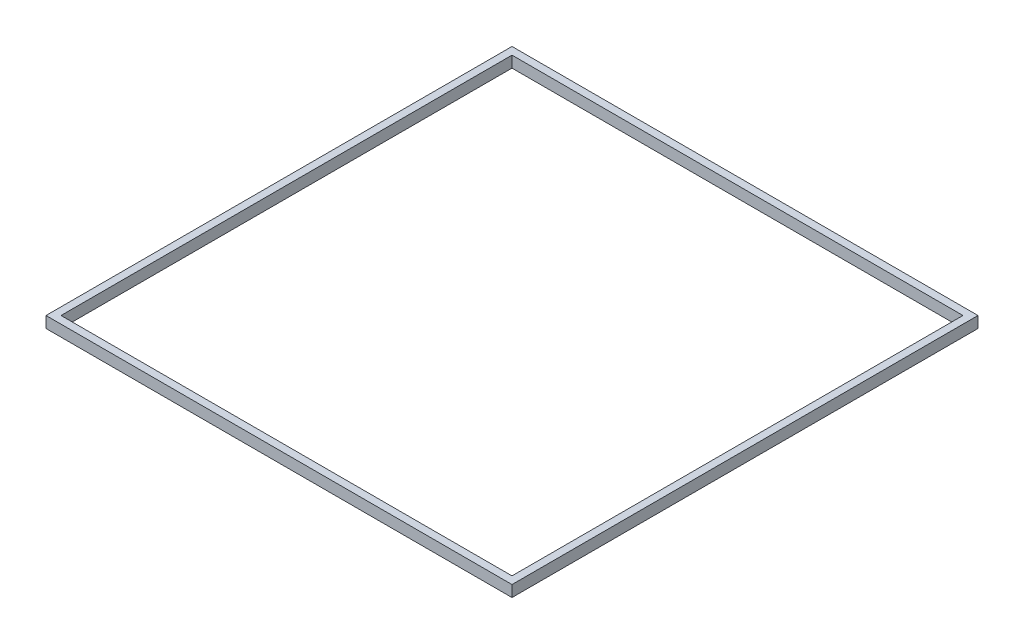
ISO-10303-21;
HEADER;
FILE_DESCRIPTION(('STEP AP214'),'2;1');
FILE_NAME('part.step','',(''),(''),'','','');
FILE_SCHEMA(('AUTOMOTIVE_DESIGN { 1 0 10303 214 1 1 1 1 }'));
ENDSEC;
DATA;
#1=APPLICATION_CONTEXT('core data for automotive mechanical design processes');
#2=APPLICATION_PROTOCOL_DEFINITION('international standard','automotive_design',2000,#1);
#3=PRODUCT_CONTEXT('',#1,'mechanical');
#4=PRODUCT('Part','Part','',(#3));
#5=PRODUCT_RELATED_PRODUCT_CATEGORY('part','',(#4));
#6=PRODUCT_DEFINITION_FORMATION('','',#4);
#7=PRODUCT_DEFINITION_CONTEXT('part definition',#1,'design');
#8=PRODUCT_DEFINITION('design','',#6,#7);
#9=PRODUCT_DEFINITION_SHAPE('','',#8);
#10=(LENGTH_UNIT() NAMED_UNIT(*) SI_UNIT(.MILLI.,.METRE.));
#11=(NAMED_UNIT(*) PLANE_ANGLE_UNIT() SI_UNIT($,.RADIAN.));
#12=(NAMED_UNIT(*) SI_UNIT($,.STERADIAN.) SOLID_ANGLE_UNIT());
#13=UNCERTAINTY_MEASURE_WITH_UNIT(LENGTH_MEASURE(1.E-05),#10,'distance_accuracy_value','');
#14=(GEOMETRIC_REPRESENTATION_CONTEXT(3) GLOBAL_UNCERTAINTY_ASSIGNED_CONTEXT((#13)) GLOBAL_UNIT_ASSIGNED_CONTEXT((#10,
#11,#12)) REPRESENTATION_CONTEXT('',''));
#15=CARTESIAN_POINT('',(0.,0.,0.));
#16=DIRECTION('',(0.,0.,1.));
#17=DIRECTION('',(1.,0.,0.));
#18=AXIS2_PLACEMENT_3D('',#15,#16,#17);
#19=CARTESIAN_POINT('',(0.,15.,0.));
#20=DIRECTION('',(0.,-1.,0.));
#21=DIRECTION('',(0.,0.,-1.));
#22=AXIS2_PLACEMENT_3D('',#19,#20,#21);
#23=PLANE('',#22);
#24=DIRECTION('',(0.,0.,-1.));
#25=VECTOR('',#24,1.);
#26=CARTESIAN_POINT('',(620.,15.,620.));
#27=LINE('',#26,#25);
#28=CARTESIAN_POINT('',(620.,15.,620.));
#29=VERTEX_POINT('',#28);
#30=CARTESIAN_POINT('',(620.,15.,-620.));
#31=VERTEX_POINT('',#30);
#32=EDGE_CURVE('E133',#29,#31,#27,.T.);
#33=ORIENTED_EDGE('',*,*,#32,.T.);
#34=DIRECTION('',(-1.,0.,0.));
#35=VECTOR('',#34,1.);
#36=CARTESIAN_POINT('',(-620.,15.,-620.));
#37=LINE('',#36,#35);
#38=CARTESIAN_POINT('',(-620.,15.,-620.));
#39=VERTEX_POINT('',#38);
#40=EDGE_CURVE('E136',#31,#39,#37,.T.);
#41=ORIENTED_EDGE('',*,*,#40,.T.);
#42=DIRECTION('',(0.,0.,1.));
#43=VECTOR('',#42,1.);
#44=CARTESIAN_POINT('',(-620.,15.,620.));
#45=LINE('',#44,#43);
#46=CARTESIAN_POINT('',(-620.,15.,620.));
#47=VERTEX_POINT('',#46);
#48=EDGE_CURVE('E139',#39,#47,#45,.T.);
#49=ORIENTED_EDGE('',*,*,#48,.T.);
#50=DIRECTION('',(1.,0.,0.));
#51=VECTOR('',#50,1.);
#52=CARTESIAN_POINT('',(-620.,15.,620.));
#53=LINE('',#52,#51);
#54=EDGE_CURVE('E141',#47,#29,#53,.T.);
#55=ORIENTED_EDGE('',*,*,#54,.T.);
#56=EDGE_LOOP('',(#33,#41,#49,#55));
#57=FACE_BOUND('',#56,.T.);
#58=DIRECTION('',(0.,0.,-1.));
#59=VECTOR('',#58,1.);
#60=CARTESIAN_POINT('',(600.,15.,600.));
#61=LINE('',#60,#59);
#62=CARTESIAN_POINT('',(600.,15.,600.));
#63=VERTEX_POINT('',#62);
#64=CARTESIAN_POINT('',(600.,15.,-600.));
#65=VERTEX_POINT('',#64);
#66=EDGE_CURVE('E97',#63,#65,#61,.T.);
#67=ORIENTED_EDGE('',*,*,#66,.F.);
#68=DIRECTION('',(1.,0.,0.));
#69=VECTOR('',#68,1.);
#70=CARTESIAN_POINT('',(-600.,15.,600.));
#71=LINE('',#70,#69);
#72=CARTESIAN_POINT('',(-600.,15.,600.));
#73=VERTEX_POINT('',#72);
#74=EDGE_CURVE('E119',#73,#63,#71,.T.);
#75=ORIENTED_EDGE('',*,*,#74,.F.);
#76=DIRECTION('',(0.,0.,1.));
#77=VECTOR('',#76,1.);
#78=CARTESIAN_POINT('',(-600.,15.,600.));
#79=LINE('',#78,#77);
#80=CARTESIAN_POINT('',(-600.,15.,-600.));
#81=VERTEX_POINT('',#80);
#82=EDGE_CURVE('E117',#81,#73,#79,.T.);
#83=ORIENTED_EDGE('',*,*,#82,.F.);
#84=DIRECTION('',(-1.,0.,0.));
#85=VECTOR('',#84,1.);
#86=CARTESIAN_POINT('',(-600.,15.,-600.));
#87=LINE('',#86,#85);
#88=EDGE_CURVE('E105',#65,#81,#87,.T.);
#89=ORIENTED_EDGE('',*,*,#88,.F.);
#90=EDGE_LOOP('',(#67,#75,#83,#89));
#91=FACE_BOUND('',#90,.T.);
#92=ADVANCED_FACE('F32',(#57,#91),#23,.F.);
#93=CARTESIAN_POINT('',(0.,-15.,0.));
#94=DIRECTION('',(0.,-1.,0.));
#95=DIRECTION('',(0.,0.,-1.));
#96=AXIS2_PLACEMENT_3D('',#93,#94,#95);
#97=PLANE('',#96);
#98=DIRECTION('',(0.,0.,-1.));
#99=VECTOR('',#98,1.);
#100=CARTESIAN_POINT('',(620.,-15.,620.));
#101=LINE('',#100,#99);
#102=CARTESIAN_POINT('',(620.,-15.,620.));
#103=VERTEX_POINT('',#102);
#104=CARTESIAN_POINT('',(620.,-15.,-620.));
#105=VERTEX_POINT('',#104);
#106=EDGE_CURVE('E113',#103,#105,#101,.T.);
#107=ORIENTED_EDGE('',*,*,#106,.F.);
#108=DIRECTION('',(1.,0.,0.));
#109=VECTOR('',#108,1.);
#110=CARTESIAN_POINT('',(-620.,-15.,620.));
#111=LINE('',#110,#109);
#112=CARTESIAN_POINT('',(-620.,-15.,620.));
#113=VERTEX_POINT('',#112);
#114=EDGE_CURVE('E137',#113,#103,#111,.T.);
#115=ORIENTED_EDGE('',*,*,#114,.F.);
#116=DIRECTION('',(0.,0.,1.));
#117=VECTOR('',#116,1.);
#118=CARTESIAN_POINT('',(-620.,-15.,620.));
#119=LINE('',#118,#117);
#120=CARTESIAN_POINT('',(-620.,-15.,-620.));
#121=VERTEX_POINT('',#120);
#122=EDGE_CURVE('E148',#121,#113,#119,.T.);
#123=ORIENTED_EDGE('',*,*,#122,.F.);
#124=DIRECTION('',(-1.,0.,0.));
#125=VECTOR('',#124,1.);
#126=CARTESIAN_POINT('',(-620.,-15.,-620.));
#127=LINE('',#126,#125);
#128=EDGE_CURVE('E146',#105,#121,#127,.T.);
#129=ORIENTED_EDGE('',*,*,#128,.F.);
#130=EDGE_LOOP('',(#107,#115,#123,#129));
#131=FACE_BOUND('',#130,.T.);
#132=DIRECTION('',(1.,0.,0.));
#133=VECTOR('',#132,1.);
#134=CARTESIAN_POINT('',(-600.,-15.,600.));
#135=LINE('',#134,#133);
#136=CARTESIAN_POINT('',(-600.,-15.,600.));
#137=VERTEX_POINT('',#136);
#138=CARTESIAN_POINT('',(600.,-15.,600.));
#139=VERTEX_POINT('',#138);
#140=EDGE_CURVE('E106',#137,#139,#135,.T.);
#141=ORIENTED_EDGE('',*,*,#140,.T.);
#142=DIRECTION('',(0.,0.,-1.));
#143=VECTOR('',#142,1.);
#144=CARTESIAN_POINT('',(600.,-15.,600.));
#145=LINE('',#144,#143);
#146=CARTESIAN_POINT('',(600.,-15.,-600.));
#147=VERTEX_POINT('',#146);
#148=EDGE_CURVE('E55',#139,#147,#145,.T.);
#149=ORIENTED_EDGE('',*,*,#148,.T.);
#150=DIRECTION('',(-1.,0.,0.));
#151=VECTOR('',#150,1.);
#152=CARTESIAN_POINT('',(-600.,-15.,-600.));
#153=LINE('',#152,#151);
#154=CARTESIAN_POINT('',(-600.,-15.,-600.));
#155=VERTEX_POINT('',#154);
#156=EDGE_CURVE('E112',#147,#155,#153,.T.);
#157=ORIENTED_EDGE('',*,*,#156,.T.);
#158=DIRECTION('',(0.,0.,1.));
#159=VECTOR('',#158,1.);
#160=CARTESIAN_POINT('',(-600.,-15.,600.));
#161=LINE('',#160,#159);
#162=EDGE_CURVE('E125',#155,#137,#161,.T.);
#163=ORIENTED_EDGE('',*,*,#162,.T.);
#164=EDGE_LOOP('',(#141,#149,#157,#163));
#165=FACE_BOUND('',#164,.T.);
#166=ADVANCED_FACE('F166',(#131,#165),#97,.T.);
#167=CARTESIAN_POINT('',(620.,15.,620.));
#168=DIRECTION('',(-1.,0.,0.));
#169=DIRECTION('',(0.,0.,1.));
#170=AXIS2_PLACEMENT_3D('',#167,#168,#169);
#171=PLANE('',#170);
#172=ORIENTED_EDGE('',*,*,#106,.T.);
#173=DIRECTION('',(0.,-1.,0.));
#174=VECTOR('',#173,1.);
#175=CARTESIAN_POINT('',(620.,15.,-620.));
#176=LINE('',#175,#174);
#177=EDGE_CURVE('E11',#31,#105,#176,.T.);
#178=ORIENTED_EDGE('',*,*,#177,.F.);
#179=ORIENTED_EDGE('',*,*,#32,.F.);
#180=DIRECTION('',(0.,-1.,0.));
#181=VECTOR('',#180,1.);
#182=CARTESIAN_POINT('',(620.,15.,620.));
#183=LINE('',#182,#181);
#184=EDGE_CURVE('E143',#29,#103,#183,.T.);
#185=ORIENTED_EDGE('',*,*,#184,.T.);
#186=EDGE_LOOP('',(#172,#178,#179,#185));
#187=FACE_BOUND('',#186,.T.);
#188=ADVANCED_FACE('F34',(#187),#171,.F.);
#189=CARTESIAN_POINT('',(-620.,15.,-620.));
#190=DIRECTION('',(0.,0.,1.));
#191=DIRECTION('',(1.,0.,0.));
#192=AXIS2_PLACEMENT_3D('',#189,#190,#191);
#193=PLANE('',#192);
#194=ORIENTED_EDGE('',*,*,#128,.T.);
#195=DIRECTION('',(0.,-1.,0.));
#196=VECTOR('',#195,1.);
#197=CARTESIAN_POINT('',(-620.,15.,-620.));
#198=LINE('',#197,#196);
#199=EDGE_CURVE('E40',#39,#121,#198,.T.);
#200=ORIENTED_EDGE('',*,*,#199,.F.);
#201=ORIENTED_EDGE('',*,*,#40,.F.);
#202=ORIENTED_EDGE('',*,*,#177,.T.);
#203=EDGE_LOOP('',(#194,#200,#201,#202));
#204=FACE_BOUND('',#203,.T.);
#205=ADVANCED_FACE('F176',(#204),#193,.F.);
#206=CARTESIAN_POINT('',(-620.,15.,620.));
#207=DIRECTION('',(1.,0.,0.));
#208=DIRECTION('',(0.,0.,-1.));
#209=AXIS2_PLACEMENT_3D('',#206,#207,#208);
#210=PLANE('',#209);
#211=ORIENTED_EDGE('',*,*,#122,.T.);
#212=DIRECTION('',(0.,-1.,0.));
#213=VECTOR('',#212,1.);
#214=CARTESIAN_POINT('',(-620.,15.,620.));
#215=LINE('',#214,#213);
#216=EDGE_CURVE('E153',#47,#113,#215,.T.);
#217=ORIENTED_EDGE('',*,*,#216,.F.);
#218=ORIENTED_EDGE('',*,*,#48,.F.);
#219=ORIENTED_EDGE('',*,*,#199,.T.);
#220=EDGE_LOOP('',(#211,#217,#218,#219));
#221=FACE_BOUND('',#220,.T.);
#222=ADVANCED_FACE('F160',(#221),#210,.F.);
#223=CARTESIAN_POINT('',(-620.,15.,620.));
#224=DIRECTION('',(0.,0.,-1.));
#225=DIRECTION('',(-1.,0.,0.));
#226=AXIS2_PLACEMENT_3D('',#223,#224,#225);
#227=PLANE('',#226);
#228=ORIENTED_EDGE('',*,*,#114,.T.);
#229=ORIENTED_EDGE('',*,*,#184,.F.);
#230=ORIENTED_EDGE('',*,*,#54,.F.);
#231=ORIENTED_EDGE('',*,*,#216,.T.);
#232=EDGE_LOOP('',(#228,#229,#230,#231));
#233=FACE_BOUND('',#232,.T.);
#234=ADVANCED_FACE('F170',(#233),#227,.F.);
#235=CARTESIAN_POINT('',(600.,15.,600.));
#236=DIRECTION('',(-1.,0.,0.));
#237=DIRECTION('',(0.,0.,1.));
#238=AXIS2_PLACEMENT_3D('',#235,#236,#237);
#239=PLANE('',#238);
#240=ORIENTED_EDGE('',*,*,#148,.F.);
#241=DIRECTION('',(0.,-1.,0.));
#242=VECTOR('',#241,1.);
#243=CARTESIAN_POINT('',(600.,15.,600.));
#244=LINE('',#243,#242);
#245=EDGE_CURVE('E101',#63,#139,#244,.T.);
#246=ORIENTED_EDGE('',*,*,#245,.F.);
#247=ORIENTED_EDGE('',*,*,#66,.T.);
#248=DIRECTION('',(0.,-1.,0.));
#249=VECTOR('',#248,1.);
#250=CARTESIAN_POINT('',(600.,15.,-600.));
#251=LINE('',#250,#249);
#252=EDGE_CURVE('E100',#65,#147,#251,.T.);
#253=ORIENTED_EDGE('',*,*,#252,.T.);
#254=EDGE_LOOP('',(#240,#246,#247,#253));
#255=FACE_BOUND('',#254,.T.);
#256=ADVANCED_FACE('F99',(#255),#239,.T.);
#257=CARTESIAN_POINT('',(-600.,15.,-600.));
#258=DIRECTION('',(0.,0.,1.));
#259=DIRECTION('',(1.,0.,0.));
#260=AXIS2_PLACEMENT_3D('',#257,#258,#259);
#261=PLANE('',#260);
#262=ORIENTED_EDGE('',*,*,#156,.F.);
#263=ORIENTED_EDGE('',*,*,#252,.F.);
#264=ORIENTED_EDGE('',*,*,#88,.T.);
#265=DIRECTION('',(0.,-1.,0.));
#266=VECTOR('',#265,1.);
#267=CARTESIAN_POINT('',(-600.,15.,-600.));
#268=LINE('',#267,#266);
#269=EDGE_CURVE('E114',#81,#155,#268,.T.);
#270=ORIENTED_EDGE('',*,*,#269,.T.);
#271=EDGE_LOOP('',(#262,#263,#264,#270));
#272=FACE_BOUND('',#271,.T.);
#273=ADVANCED_FACE('F109',(#272),#261,.T.);
#274=CARTESIAN_POINT('',(-600.,15.,600.));
#275=DIRECTION('',(1.,0.,0.));
#276=DIRECTION('',(0.,0.,-1.));
#277=AXIS2_PLACEMENT_3D('',#274,#275,#276);
#278=PLANE('',#277);
#279=ORIENTED_EDGE('',*,*,#162,.F.);
#280=ORIENTED_EDGE('',*,*,#269,.F.);
#281=ORIENTED_EDGE('',*,*,#82,.T.);
#282=DIRECTION('',(0.,-1.,0.));
#283=VECTOR('',#282,1.);
#284=CARTESIAN_POINT('',(-600.,15.,600.));
#285=LINE('',#284,#283);
#286=EDGE_CURVE('E47',#73,#137,#285,.T.);
#287=ORIENTED_EDGE('',*,*,#286,.T.);
#288=EDGE_LOOP('',(#279,#280,#281,#287));
#289=FACE_BOUND('',#288,.T.);
#290=ADVANCED_FACE('F199',(#289),#278,.T.);
#291=CARTESIAN_POINT('',(-600.,15.,600.));
#292=DIRECTION('',(0.,0.,-1.));
#293=DIRECTION('',(-1.,0.,0.));
#294=AXIS2_PLACEMENT_3D('',#291,#292,#293);
#295=PLANE('',#294);
#296=ORIENTED_EDGE('',*,*,#140,.F.);
#297=ORIENTED_EDGE('',*,*,#286,.F.);
#298=ORIENTED_EDGE('',*,*,#74,.T.);
#299=ORIENTED_EDGE('',*,*,#245,.T.);
#300=EDGE_LOOP('',(#296,#297,#298,#299));
#301=FACE_BOUND('',#300,.T.);
#302=ADVANCED_FACE('F203',(#301),#295,.T.);
#303=CLOSED_SHELL('',(#92,#166,#188,#205,#222,#234,#256,#273,#290,#302));
#304=MANIFOLD_SOLID_BREP('B2',#303);
#305=ADVANCED_BREP_SHAPE_REPRESENTATION('',(#18,#304),#14);
#306=SHAPE_DEFINITION_REPRESENTATION(#9,#305);
ENDSEC;
END-ISO-10303-21;
